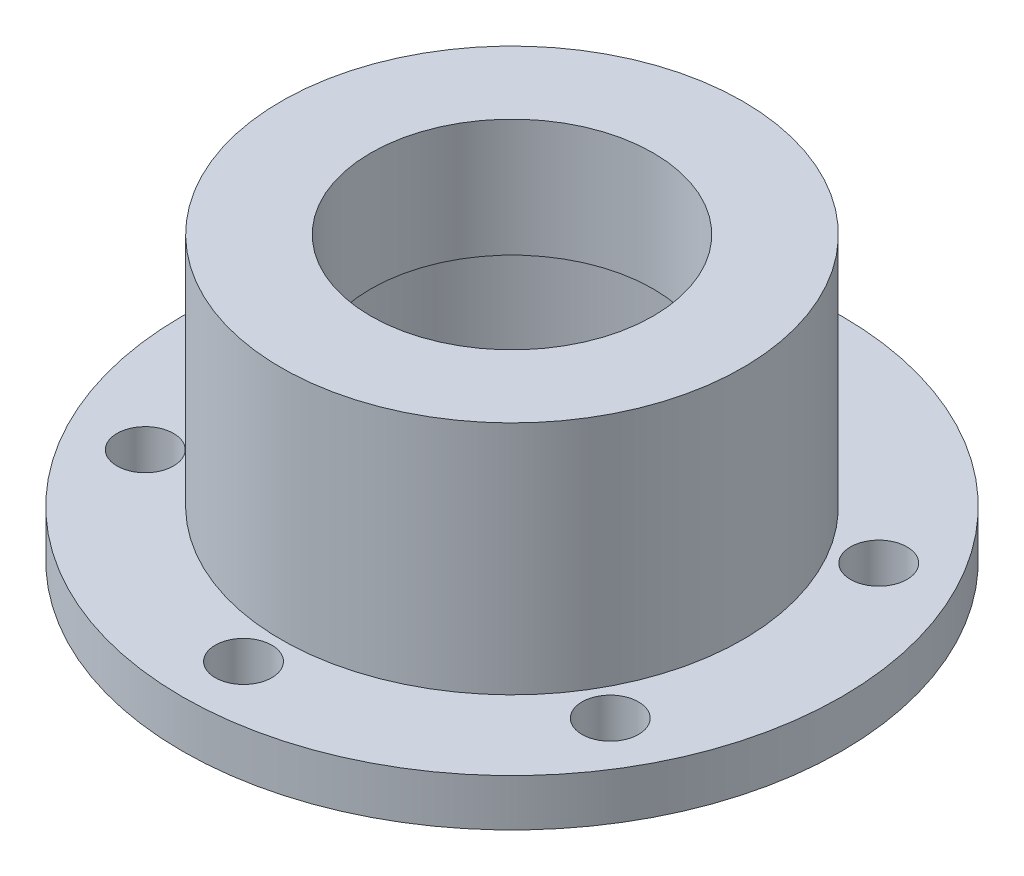
ISO-10303-21;
HEADER;
FILE_DESCRIPTION(('STEP AP214'),'2;1');
FILE_NAME('part.step','',(''),(''),'','','');
FILE_SCHEMA(('AUTOMOTIVE_DESIGN { 1 0 10303 214 1 1 1 1 }'));
ENDSEC;
DATA;
#1=APPLICATION_CONTEXT('core data for automotive mechanical design processes');
#2=APPLICATION_PROTOCOL_DEFINITION('international standard','automotive_design',2000,#1);
#3=PRODUCT_CONTEXT('',#1,'mechanical');
#4=PRODUCT('Part','Part','',(#3));
#5=PRODUCT_RELATED_PRODUCT_CATEGORY('part','',(#4));
#6=PRODUCT_DEFINITION_FORMATION('','',#4);
#7=PRODUCT_DEFINITION_CONTEXT('part definition',#1,'design');
#8=PRODUCT_DEFINITION('design','',#6,#7);
#9=PRODUCT_DEFINITION_SHAPE('','',#8);
#10=(LENGTH_UNIT() NAMED_UNIT(*) SI_UNIT(.MILLI.,.METRE.));
#11=(NAMED_UNIT(*) PLANE_ANGLE_UNIT() SI_UNIT($,.RADIAN.));
#12=(NAMED_UNIT(*) SI_UNIT($,.STERADIAN.) SOLID_ANGLE_UNIT());
#13=UNCERTAINTY_MEASURE_WITH_UNIT(LENGTH_MEASURE(1.E-05),#10,'distance_accuracy_value','');
#14=(GEOMETRIC_REPRESENTATION_CONTEXT(3) GLOBAL_UNCERTAINTY_ASSIGNED_CONTEXT((#13)) GLOBAL_UNIT_ASSIGNED_CONTEXT((#10,
#11,#12)) REPRESENTATION_CONTEXT('',''));
#15=CARTESIAN_POINT('',(0.,0.,0.));
#16=DIRECTION('',(0.,0.,1.));
#17=DIRECTION('',(1.,0.,0.));
#18=AXIS2_PLACEMENT_3D('',#15,#16,#17);
#19=CARTESIAN_POINT('',(0.,0.,0.));
#20=DIRECTION('',(0.,-1.,0.));
#21=DIRECTION('',(0.,0.,-1.));
#22=AXIS2_PLACEMENT_3D('',#19,#20,#21);
#23=CYLINDRICAL_SURFACE('',#22,24.5);
#24=CARTESIAN_POINT('',(0.,25.,0.));
#25=DIRECTION('',(0.,-1.,0.));
#26=DIRECTION('',(0.,0.,-1.));
#27=AXIS2_PLACEMENT_3D('',#24,#25,#26);
#28=CIRCLE('',#27,24.5);
#29=CARTESIAN_POINT('',(0.,25.,-24.5));
#30=VERTEX_POINT('',#29);
#31=EDGE_CURVE('E58',#30,#30,#28,.T.);
#32=ORIENTED_EDGE('',*,*,#31,.T.);
#33=EDGE_LOOP('',(#32));
#34=FACE_BOUND('',#33,.T.);
#35=CARTESIAN_POINT('',(0.,0.,0.));
#36=DIRECTION('',(0.,-1.,0.));
#37=DIRECTION('',(0.,0.,-1.));
#38=AXIS2_PLACEMENT_3D('',#35,#36,#37);
#39=CIRCLE('',#38,24.5);
#40=CARTESIAN_POINT('',(0.,0.,-24.5));
#41=VERTEX_POINT('',#40);
#42=EDGE_CURVE('E10',#41,#41,#39,.T.);
#43=ORIENTED_EDGE('',*,*,#42,.F.);
#44=EDGE_LOOP('',(#43));
#45=FACE_BOUND('',#44,.T.);
#46=ADVANCED_FACE('F30',(#34,#45),#23,.T.);
#47=CARTESIAN_POINT('',(24.5,0.,0.));
#48=DIRECTION('',(0.,1.,0.));
#49=DIRECTION('',(0.,0.,1.));
#50=AXIS2_PLACEMENT_3D('',#47,#48,#49);
#51=PLANE('',#50);
#52=CARTESIAN_POINT('',(-24.6817240078557,0.,-14.2499999999986));
#53=DIRECTION('',(0.,1.,0.));
#54=DIRECTION('',(0.,0.,1.));
#55=AXIS2_PLACEMENT_3D('',#52,#53,#54);
#56=CIRCLE('',#55,3.00000000000152);
#57=CARTESIAN_POINT('',(-24.6817240078557,0.,-11.2499999999971));
#58=VERTEX_POINT('',#57);
#59=EDGE_CURVE('E91',#58,#58,#56,.T.);
#60=ORIENTED_EDGE('',*,*,#59,.F.);
#61=EDGE_LOOP('',(#60));
#62=FACE_BOUND('',#61,.T.);
#63=CARTESIAN_POINT('',(-24.6817240078541,0.,14.2500000000014));
#64=DIRECTION('',(0.,1.,0.));
#65=DIRECTION('',(0.,0.,1.));
#66=AXIS2_PLACEMENT_3D('',#63,#64,#65);
#67=CIRCLE('',#66,3.00000000000299);
#68=CARTESIAN_POINT('',(-24.6817240078541,0.,17.2500000000044));
#69=VERTEX_POINT('',#68);
#70=EDGE_CURVE('E85',#69,#69,#67,.T.);
#71=ORIENTED_EDGE('',*,*,#70,.F.);
#72=EDGE_LOOP('',(#71));
#73=FACE_BOUND('',#72,.T.);
#74=CARTESIAN_POINT('',(3.23309438831092E-12,0.,28.5));
#75=DIRECTION('',(0.,1.,0.));
#76=DIRECTION('',(0.,0.,1.));
#77=AXIS2_PLACEMENT_3D('',#74,#75,#76);
#78=CIRCLE('',#77,3.00000000000328);
#79=CARTESIAN_POINT('',(3.23309438831092E-12,0.,31.5000000000033));
#80=VERTEX_POINT('',#79);
#81=EDGE_CURVE('E79',#80,#80,#78,.T.);
#82=ORIENTED_EDGE('',*,*,#81,.F.);
#83=EDGE_LOOP('',(#82));
#84=FACE_BOUND('',#83,.T.);
#85=CARTESIAN_POINT('',(24.6817240078589,0.,14.2499999999986));
#86=DIRECTION('',(0.,1.,0.));
#87=DIRECTION('',(0.,0.,1.));
#88=AXIS2_PLACEMENT_3D('',#85,#86,#87);
#89=CIRCLE('',#88,3.00000000000204);
#90=CARTESIAN_POINT('',(24.6817240078589,0.,17.2500000000006));
#91=VERTEX_POINT('',#90);
#92=EDGE_CURVE('E73',#91,#91,#89,.T.);
#93=ORIENTED_EDGE('',*,*,#92,.F.);
#94=EDGE_LOOP('',(#93));
#95=FACE_BOUND('',#94,.T.);
#96=CARTESIAN_POINT('',(24.6817240078573,0.,-14.2500000000014));
#97=DIRECTION('',(0.,1.,0.));
#98=DIRECTION('',(0.,0.,1.));
#99=AXIS2_PLACEMENT_3D('',#96,#97,#98);
#100=CIRCLE('',#99,3.00000000000043);
#101=CARTESIAN_POINT('',(24.6817240078573,0.,-11.250000000001));
#102=VERTEX_POINT('',#101);
#103=EDGE_CURVE('E67',#102,#102,#100,.T.);
#104=ORIENTED_EDGE('',*,*,#103,.F.);
#105=EDGE_LOOP('',(#104));
#106=FACE_BOUND('',#105,.T.);
#107=CARTESIAN_POINT('',(0.,0.,-28.5));
#108=DIRECTION('',(0.,1.,0.));
#109=DIRECTION('',(0.,0.,1.));
#110=AXIS2_PLACEMENT_3D('',#107,#108,#109);
#111=CIRCLE('',#110,3.);
#112=CARTESIAN_POINT('',(0.,0.,-25.5));
#113=VERTEX_POINT('',#112);
#114=EDGE_CURVE('E61',#113,#113,#111,.T.);
#115=ORIENTED_EDGE('',*,*,#114,.F.);
#116=EDGE_LOOP('',(#115));
#117=FACE_BOUND('',#116,.T.);
#118=ORIENTED_EDGE('',*,*,#42,.T.);
#119=EDGE_LOOP('',(#118));
#120=FACE_BOUND('',#119,.T.);
#121=CARTESIAN_POINT('',(0.,0.,0.));
#122=DIRECTION('',(0.,-1.,0.));
#123=DIRECTION('',(0.,0.,-1.));
#124=AXIS2_PLACEMENT_3D('',#121,#122,#123);
#125=CIRCLE('',#124,35.);
#126=CARTESIAN_POINT('',(0.,0.,-35.));
#127=VERTEX_POINT('',#126);
#128=EDGE_CURVE('E36',#127,#127,#125,.T.);
#129=ORIENTED_EDGE('',*,*,#128,.F.);
#130=EDGE_LOOP('',(#129));
#131=FACE_BOUND('',#130,.T.);
#132=ADVANCED_FACE('F113',(#62,#73,#84,#95,#106,#117,#120,#131),#51,.T.);
#133=CARTESIAN_POINT('',(0.,0.,0.));
#134=DIRECTION('',(0.,-1.,0.));
#135=DIRECTION('',(0.,0.,-1.));
#136=AXIS2_PLACEMENT_3D('',#133,#134,#135);
#137=CYLINDRICAL_SURFACE('',#136,35.);
#138=ORIENTED_EDGE('',*,*,#128,.T.);
#139=EDGE_LOOP('',(#138));
#140=FACE_BOUND('',#139,.T.);
#141=CARTESIAN_POINT('',(0.,-5.,0.));
#142=DIRECTION('',(0.,-1.,0.));
#143=DIRECTION('',(0.,0.,-1.));
#144=AXIS2_PLACEMENT_3D('',#141,#142,#143);
#145=CIRCLE('',#144,35.);
#146=CARTESIAN_POINT('',(0.,-5.,-35.));
#147=VERTEX_POINT('',#146);
#148=EDGE_CURVE('E40',#147,#147,#145,.T.);
#149=ORIENTED_EDGE('',*,*,#148,.F.);
#150=EDGE_LOOP('',(#149));
#151=FACE_BOUND('',#150,.T.);
#152=ADVANCED_FACE('F118',(#140,#151),#137,.T.);
#153=CARTESIAN_POINT('',(35.,-5.,0.));
#154=DIRECTION('',(0.,-1.,0.));
#155=DIRECTION('',(0.,0.,-1.));
#156=AXIS2_PLACEMENT_3D('',#153,#154,#155);
#157=PLANE('',#156);
#158=CARTESIAN_POINT('',(-24.6817240078557,-5.,-14.2499999999986));
#159=DIRECTION('',(0.,1.,0.));
#160=DIRECTION('',(0.,0.,1.));
#161=AXIS2_PLACEMENT_3D('',#158,#159,#160);
#162=CIRCLE('',#161,3.00000000000152);
#163=CARTESIAN_POINT('',(-24.6817240078557,-5.,-11.2499999999971));
#164=VERTEX_POINT('',#163);
#165=EDGE_CURVE('E94',#164,#164,#162,.T.);
#166=ORIENTED_EDGE('',*,*,#165,.T.);
#167=EDGE_LOOP('',(#166));
#168=FACE_BOUND('',#167,.T.);
#169=CARTESIAN_POINT('',(-24.6817240078541,-5.,14.2500000000014));
#170=DIRECTION('',(0.,1.,0.));
#171=DIRECTION('',(0.,0.,1.));
#172=AXIS2_PLACEMENT_3D('',#169,#170,#171);
#173=CIRCLE('',#172,3.00000000000299);
#174=CARTESIAN_POINT('',(-24.6817240078541,-5.,17.2500000000044));
#175=VERTEX_POINT('',#174);
#176=EDGE_CURVE('E88',#175,#175,#173,.T.);
#177=ORIENTED_EDGE('',*,*,#176,.T.);
#178=EDGE_LOOP('',(#177));
#179=FACE_BOUND('',#178,.T.);
#180=CARTESIAN_POINT('',(3.23309438831092E-12,-5.,28.5));
#181=DIRECTION('',(0.,1.,0.));
#182=DIRECTION('',(0.,0.,1.));
#183=AXIS2_PLACEMENT_3D('',#180,#181,#182);
#184=CIRCLE('',#183,3.00000000000328);
#185=CARTESIAN_POINT('',(3.23309438831092E-12,-5.,31.5000000000033));
#186=VERTEX_POINT('',#185);
#187=EDGE_CURVE('E82',#186,#186,#184,.T.);
#188=ORIENTED_EDGE('',*,*,#187,.T.);
#189=EDGE_LOOP('',(#188));
#190=FACE_BOUND('',#189,.T.);
#191=CARTESIAN_POINT('',(24.6817240078589,-5.,14.2499999999986));
#192=DIRECTION('',(0.,1.,0.));
#193=DIRECTION('',(0.,0.,1.));
#194=AXIS2_PLACEMENT_3D('',#191,#192,#193);
#195=CIRCLE('',#194,3.00000000000204);
#196=CARTESIAN_POINT('',(24.6817240078589,-5.,17.2500000000006));
#197=VERTEX_POINT('',#196);
#198=EDGE_CURVE('E76',#197,#197,#195,.T.);
#199=ORIENTED_EDGE('',*,*,#198,.T.);
#200=EDGE_LOOP('',(#199));
#201=FACE_BOUND('',#200,.T.);
#202=CARTESIAN_POINT('',(24.6817240078573,-5.,-14.2500000000014));
#203=DIRECTION('',(0.,1.,0.));
#204=DIRECTION('',(0.,0.,1.));
#205=AXIS2_PLACEMENT_3D('',#202,#203,#204);
#206=CIRCLE('',#205,3.00000000000043);
#207=CARTESIAN_POINT('',(24.6817240078573,-5.,-11.250000000001));
#208=VERTEX_POINT('',#207);
#209=EDGE_CURVE('E70',#208,#208,#206,.T.);
#210=ORIENTED_EDGE('',*,*,#209,.T.);
#211=EDGE_LOOP('',(#210));
#212=FACE_BOUND('',#211,.T.);
#213=CARTESIAN_POINT('',(0.,-5.,-28.5));
#214=DIRECTION('',(0.,1.,0.));
#215=DIRECTION('',(0.,0.,1.));
#216=AXIS2_PLACEMENT_3D('',#213,#214,#215);
#217=CIRCLE('',#216,3.);
#218=CARTESIAN_POINT('',(0.,-5.,-25.5));
#219=VERTEX_POINT('',#218);
#220=EDGE_CURVE('E64',#219,#219,#217,.T.);
#221=ORIENTED_EDGE('',*,*,#220,.T.);
#222=EDGE_LOOP('',(#221));
#223=FACE_BOUND('',#222,.T.);
#224=ORIENTED_EDGE('',*,*,#148,.T.);
#225=EDGE_LOOP('',(#224));
#226=FACE_BOUND('',#225,.T.);
#227=CARTESIAN_POINT('',(0.,-5.,0.));
#228=DIRECTION('',(0.,-1.,0.));
#229=DIRECTION('',(0.,0.,-1.));
#230=AXIS2_PLACEMENT_3D('',#227,#228,#229);
#231=CIRCLE('',#230,20.);
#232=CARTESIAN_POINT('',(0.,-5.,-20.));
#233=VERTEX_POINT('',#232);
#234=EDGE_CURVE('E44',#233,#233,#231,.T.);
#235=ORIENTED_EDGE('',*,*,#234,.F.);
#236=EDGE_LOOP('',(#235));
#237=FACE_BOUND('',#236,.T.);
#238=ADVANCED_FACE('F98',(#168,#179,#190,#201,#212,#223,#226,#237),#157,.T.);
#239=CARTESIAN_POINT('',(0.,0.,0.));
#240=DIRECTION('',(0.,-1.,0.));
#241=DIRECTION('',(0.,0.,-1.));
#242=AXIS2_PLACEMENT_3D('',#239,#240,#241);
#243=CYLINDRICAL_SURFACE('',#242,20.);
#244=ORIENTED_EDGE('',*,*,#234,.T.);
#245=EDGE_LOOP('',(#244));
#246=FACE_BOUND('',#245,.T.);
#247=CARTESIAN_POINT('',(0.,12.5,0.));
#248=DIRECTION('',(0.,-1.,0.));
#249=DIRECTION('',(0.,0.,-1.));
#250=AXIS2_PLACEMENT_3D('',#247,#248,#249);
#251=CIRCLE('',#250,20.);
#252=CARTESIAN_POINT('',(0.,12.5,-20.));
#253=VERTEX_POINT('',#252);
#254=EDGE_CURVE('E49',#253,#253,#251,.T.);
#255=ORIENTED_EDGE('',*,*,#254,.F.);
#256=EDGE_LOOP('',(#255));
#257=FACE_BOUND('',#256,.T.);
#258=ADVANCED_FACE('F143',(#246,#257),#243,.F.);
#259=CARTESIAN_POINT('',(20.,12.5,0.));
#260=DIRECTION('',(0.,-1.,0.));
#261=DIRECTION('',(0.,0.,-1.));
#262=AXIS2_PLACEMENT_3D('',#259,#260,#261);
#263=PLANE('',#262);
#264=ORIENTED_EDGE('',*,*,#254,.T.);
#265=EDGE_LOOP('',(#264));
#266=FACE_BOUND('',#265,.T.);
#267=CARTESIAN_POINT('',(0.,12.5,0.));
#268=DIRECTION('',(0.,-1.,0.));
#269=DIRECTION('',(0.,0.,-1.));
#270=AXIS2_PLACEMENT_3D('',#267,#268,#269);
#271=CIRCLE('',#270,15.);
#272=CARTESIAN_POINT('',(0.,12.5,-15.));
#273=VERTEX_POINT('',#272);
#274=EDGE_CURVE('E52',#273,#273,#271,.T.);
#275=ORIENTED_EDGE('',*,*,#274,.F.);
#276=EDGE_LOOP('',(#275));
#277=FACE_BOUND('',#276,.T.);
#278=ADVANCED_FACE('F136',(#266,#277),#263,.T.);
#279=CARTESIAN_POINT('',(0.,0.,0.));
#280=DIRECTION('',(0.,-1.,0.));
#281=DIRECTION('',(0.,0.,-1.));
#282=AXIS2_PLACEMENT_3D('',#279,#280,#281);
#283=CYLINDRICAL_SURFACE('',#282,15.);
#284=ORIENTED_EDGE('',*,*,#274,.T.);
#285=EDGE_LOOP('',(#284));
#286=FACE_BOUND('',#285,.T.);
#287=CARTESIAN_POINT('',(0.,25.,0.));
#288=DIRECTION('',(0.,-1.,0.));
#289=DIRECTION('',(0.,0.,-1.));
#290=AXIS2_PLACEMENT_3D('',#287,#288,#289);
#291=CIRCLE('',#290,15.);
#292=CARTESIAN_POINT('',(0.,25.,-15.));
#293=VERTEX_POINT('',#292);
#294=EDGE_CURVE('E55',#293,#293,#291,.T.);
#295=ORIENTED_EDGE('',*,*,#294,.F.);
#296=EDGE_LOOP('',(#295));
#297=FACE_BOUND('',#296,.T.);
#298=ADVANCED_FACE('F126',(#286,#297),#283,.F.);
#299=CARTESIAN_POINT('',(15.,25.,0.));
#300=DIRECTION('',(0.,1.,0.));
#301=DIRECTION('',(0.,0.,1.));
#302=AXIS2_PLACEMENT_3D('',#299,#300,#301);
#303=PLANE('',#302);
#304=ORIENTED_EDGE('',*,*,#294,.T.);
#305=EDGE_LOOP('',(#304));
#306=FACE_BOUND('',#305,.T.);
#307=ORIENTED_EDGE('',*,*,#31,.F.);
#308=EDGE_LOOP('',(#307));
#309=FACE_BOUND('',#308,.T.);
#310=ADVANCED_FACE('F123',(#306,#309),#303,.T.);
#311=CARTESIAN_POINT('',(0.,-5.,-28.5));
#312=DIRECTION('',(0.,1.,0.));
#313=DIRECTION('',(0.,0.,1.));
#314=AXIS2_PLACEMENT_3D('',#311,#312,#313);
#315=CYLINDRICAL_SURFACE('',#314,3.);
#316=ORIENTED_EDGE('',*,*,#114,.T.);
#317=EDGE_LOOP('',(#316));
#318=FACE_BOUND('',#317,.T.);
#319=ORIENTED_EDGE('',*,*,#220,.F.);
#320=EDGE_LOOP('',(#319));
#321=FACE_BOUND('',#320,.T.);
#322=ADVANCED_FACE('F125',(#318,#321),#315,.F.);
#323=CARTESIAN_POINT('',(24.6817240078573,-5.,-14.2500000000014));
#324=DIRECTION('',(0.,1.,0.));
#325=DIRECTION('',(0.,0.,1.));
#326=AXIS2_PLACEMENT_3D('',#323,#324,#325);
#327=CYLINDRICAL_SURFACE('',#326,3.00000000000043);
#328=ORIENTED_EDGE('',*,*,#103,.T.);
#329=EDGE_LOOP('',(#328));
#330=FACE_BOUND('',#329,.T.);
#331=ORIENTED_EDGE('',*,*,#209,.F.);
#332=EDGE_LOOP('',(#331));
#333=FACE_BOUND('',#332,.T.);
#334=ADVANCED_FACE('F133',(#330,#333),#327,.F.);
#335=CARTESIAN_POINT('',(24.6817240078589,-5.,14.2499999999986));
#336=DIRECTION('',(0.,1.,0.));
#337=DIRECTION('',(0.,0.,1.));
#338=AXIS2_PLACEMENT_3D('',#335,#336,#337);
#339=CYLINDRICAL_SURFACE('',#338,3.00000000000204);
#340=ORIENTED_EDGE('',*,*,#92,.T.);
#341=EDGE_LOOP('',(#340));
#342=FACE_BOUND('',#341,.T.);
#343=ORIENTED_EDGE('',*,*,#198,.F.);
#344=EDGE_LOOP('',(#343));
#345=FACE_BOUND('',#344,.T.);
#346=ADVANCED_FACE('F217',(#342,#345),#339,.F.);
#347=CARTESIAN_POINT('',(3.23309438831092E-12,-5.,28.5));
#348=DIRECTION('',(0.,1.,0.));
#349=DIRECTION('',(0.,0.,1.));
#350=AXIS2_PLACEMENT_3D('',#347,#348,#349);
#351=CYLINDRICAL_SURFACE('',#350,3.00000000000328);
#352=ORIENTED_EDGE('',*,*,#81,.T.);
#353=EDGE_LOOP('',(#352));
#354=FACE_BOUND('',#353,.T.);
#355=ORIENTED_EDGE('',*,*,#187,.F.);
#356=EDGE_LOOP('',(#355));
#357=FACE_BOUND('',#356,.T.);
#358=ADVANCED_FACE('F109',(#354,#357),#351,.F.);
#359=CARTESIAN_POINT('',(-24.6817240078541,-5.,14.2500000000014));
#360=DIRECTION('',(0.,1.,0.));
#361=DIRECTION('',(0.,0.,1.));
#362=AXIS2_PLACEMENT_3D('',#359,#360,#361);
#363=CYLINDRICAL_SURFACE('',#362,3.00000000000299);
#364=ORIENTED_EDGE('',*,*,#70,.T.);
#365=EDGE_LOOP('',(#364));
#366=FACE_BOUND('',#365,.T.);
#367=ORIENTED_EDGE('',*,*,#176,.F.);
#368=EDGE_LOOP('',(#367));
#369=FACE_BOUND('',#368,.T.);
#370=ADVANCED_FACE('F103',(#366,#369),#363,.F.);
#371=CARTESIAN_POINT('',(-24.6817240078557,-5.,-14.2499999999986));
#372=DIRECTION('',(0.,1.,0.));
#373=DIRECTION('',(0.,0.,1.));
#374=AXIS2_PLACEMENT_3D('',#371,#372,#373);
#375=CYLINDRICAL_SURFACE('',#374,3.00000000000152);
#376=ORIENTED_EDGE('',*,*,#59,.T.);
#377=EDGE_LOOP('',(#376));
#378=FACE_BOUND('',#377,.T.);
#379=ORIENTED_EDGE('',*,*,#165,.F.);
#380=EDGE_LOOP('',(#379));
#381=FACE_BOUND('',#380,.T.);
#382=ADVANCED_FACE('F101',(#378,#381),#375,.F.);
#383=CLOSED_SHELL('',(#46,#132,#152,#238,#258,#278,#298,#310,#322,#334,#346,#358,#370,#382));
#384=MANIFOLD_SOLID_BREP('B2',#383);
#385=ADVANCED_BREP_SHAPE_REPRESENTATION('',(#18,#384),#14);
#386=SHAPE_DEFINITION_REPRESENTATION(#9,#385);
ENDSEC;
END-ISO-10303-21;
